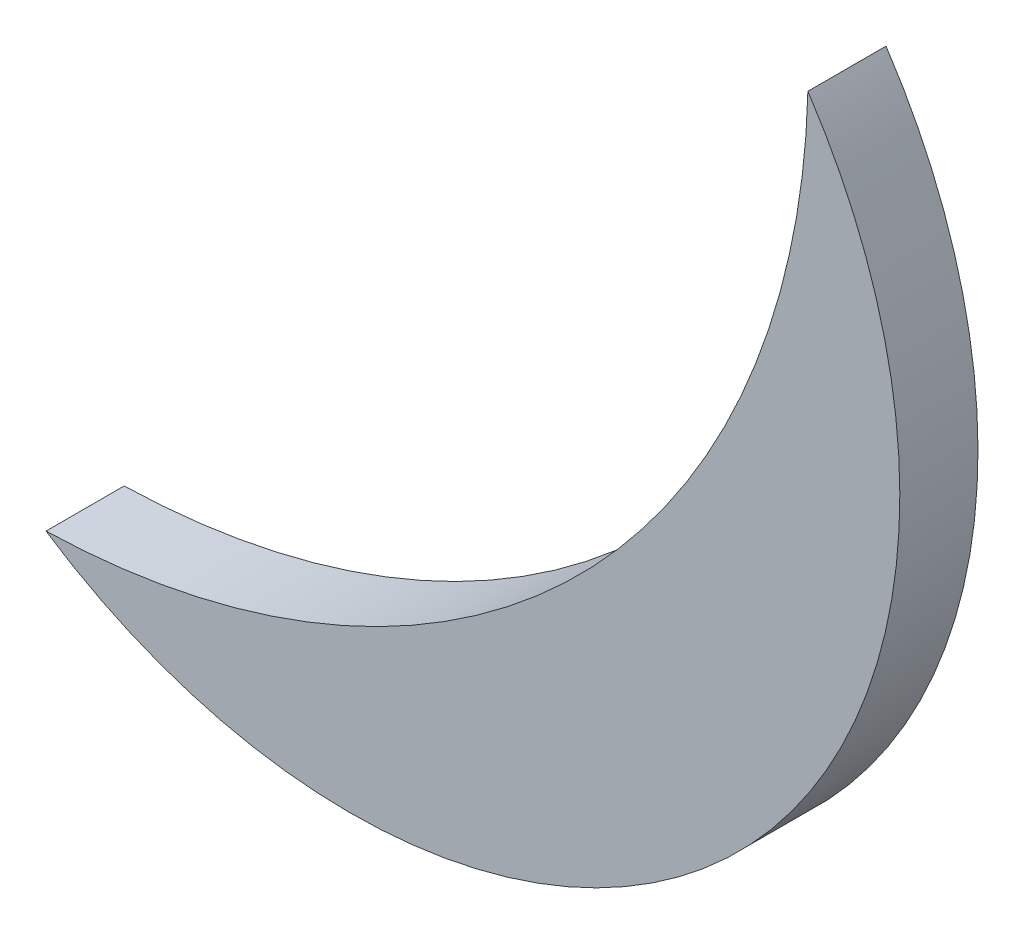
ISO-10303-21;
HEADER;
FILE_DESCRIPTION(('STEP AP214'),'2;1');
FILE_NAME('part.step','',(''),(''),'','','');
FILE_SCHEMA(('AUTOMOTIVE_DESIGN { 1 0 10303 214 1 1 1 1 }'));
ENDSEC;
DATA;
#1=APPLICATION_CONTEXT('core data for automotive mechanical design processes');
#2=APPLICATION_PROTOCOL_DEFINITION('international standard','automotive_design',2000,#1);
#3=PRODUCT_CONTEXT('',#1,'mechanical');
#4=PRODUCT('Part','Part','',(#3));
#5=PRODUCT_RELATED_PRODUCT_CATEGORY('part','',(#4));
#6=PRODUCT_DEFINITION_FORMATION('','',#4);
#7=PRODUCT_DEFINITION_CONTEXT('part definition',#1,'design');
#8=PRODUCT_DEFINITION('design','',#6,#7);
#9=PRODUCT_DEFINITION_SHAPE('','',#8);
#10=(LENGTH_UNIT() NAMED_UNIT(*) SI_UNIT(.MILLI.,.METRE.));
#11=(NAMED_UNIT(*) PLANE_ANGLE_UNIT() SI_UNIT($,.RADIAN.));
#12=(NAMED_UNIT(*) SI_UNIT($,.STERADIAN.) SOLID_ANGLE_UNIT());
#13=UNCERTAINTY_MEASURE_WITH_UNIT(LENGTH_MEASURE(1.E-05),#10,'distance_accuracy_value','');
#14=(GEOMETRIC_REPRESENTATION_CONTEXT(3) GLOBAL_UNCERTAINTY_ASSIGNED_CONTEXT((#13)) GLOBAL_UNIT_ASSIGNED_CONTEXT((#10,
#11,#12)) REPRESENTATION_CONTEXT('',''));
#15=CARTESIAN_POINT('',(0.,0.,0.));
#16=DIRECTION('',(0.,0.,1.));
#17=DIRECTION('',(1.,0.,0.));
#18=AXIS2_PLACEMENT_3D('',#15,#16,#17);
#19=CARTESIAN_POINT('',(107.04733226,84.85266748,0.));
#20=DIRECTION('',(0.,0.,-1.));
#21=DIRECTION('',(-0.707106781186519,-0.707106781186576,0.));
#22=AXIS2_PLACEMENT_3D('',#19,#20,#21);
#23=CYLINDRICAL_SURFACE('',#22,0.249999554103223);
#24=CARTESIAN_POINT('',(107.04733226,84.85266748,0.03556));
#25=DIRECTION('',(0.,0.,1.));
#26=DIRECTION('',(-0.707106781186519,-0.707106781186576,0.));
#27=AXIS2_PLACEMENT_3D('',#24,#25,#26);
#28=CIRCLE('',#27,0.249999554103223);
#29=CARTESIAN_POINT('',(106.90887421066,84.6445109388468,0.03556));
#30=VERTEX_POINT('',#29);
#31=CARTESIAN_POINT('',(107.255488801153,84.9911255293397,0.03556));
#32=VERTEX_POINT('',#31);
#33=EDGE_CURVE('E11',#30,#32,#28,.T.);
#34=ORIENTED_EDGE('',*,*,#33,.F.);
#35=DIRECTION('',(0.,0.,1.));
#36=VECTOR('',#35,1.);
#37=CARTESIAN_POINT('',(106.90887421066,84.6445109388468,0.));
#38=LINE('',#37,#36);
#39=CARTESIAN_POINT('',(106.90887421066,84.6445109388468,0.));
#40=VERTEX_POINT('',#39);
#41=EDGE_CURVE('E24',#40,#30,#38,.T.);
#42=ORIENTED_EDGE('',*,*,#41,.F.);
#43=CARTESIAN_POINT('',(107.04733226,84.85266748,0.));
#44=DIRECTION('',(0.,0.,1.));
#45=DIRECTION('',(-0.707106781186519,-0.707106781186576,0.));
#46=AXIS2_PLACEMENT_3D('',#43,#44,#45);
#47=CIRCLE('',#46,0.249999554103223);
#48=CARTESIAN_POINT('',(107.255488801153,84.9911255293397,0.));
#49=VERTEX_POINT('',#48);
#50=EDGE_CURVE('E46',#40,#49,#47,.T.);
#51=ORIENTED_EDGE('',*,*,#50,.T.);
#52=DIRECTION('',(0.,0.,1.));
#53=VECTOR('',#52,1.);
#54=CARTESIAN_POINT('',(107.255488801153,84.9911255293397,0.));
#55=LINE('',#54,#53);
#56=EDGE_CURVE('E37',#49,#32,#55,.T.);
#57=ORIENTED_EDGE('',*,*,#56,.T.);
#58=EDGE_LOOP('',(#34,#42,#51,#57));
#59=FACE_BOUND('',#58,.T.);
#60=ADVANCED_FACE('F17',(#59),#23,.T.);
#61=CARTESIAN_POINT('',(106.89999956,85.00000018,0.));
#62=DIRECTION('',(0.,0.,-1.));
#63=DIRECTION('',(1.,0.,0.));
#64=AXIS2_PLACEMENT_3D('',#61,#62,#63);
#65=CYLINDRICAL_SURFACE('',#64,0.3556);
#66=ORIENTED_EDGE('',*,*,#41,.T.);
#67=CARTESIAN_POINT('',(106.89999956,85.00000018,0.03556));
#68=DIRECTION('',(0.,0.,1.));
#69=DIRECTION('',(1.,0.,0.));
#70=AXIS2_PLACEMENT_3D('',#67,#68,#69);
#71=CIRCLE('',#70,0.3556);
#72=EDGE_CURVE('E45',#30,#32,#71,.T.);
#73=ORIENTED_EDGE('',*,*,#72,.T.);
#74=ORIENTED_EDGE('',*,*,#56,.F.);
#75=CARTESIAN_POINT('',(106.89999956,85.00000018,0.));
#76=DIRECTION('',(0.,0.,1.));
#77=DIRECTION('',(1.,0.,0.));
#78=AXIS2_PLACEMENT_3D('',#75,#76,#77);
#79=CIRCLE('',#78,0.3556);
#80=EDGE_CURVE('E43',#40,#49,#79,.T.);
#81=ORIENTED_EDGE('',*,*,#80,.F.);
#82=EDGE_LOOP('',(#66,#73,#74,#81));
#83=FACE_BOUND('',#82,.T.);
#84=ADVANCED_FACE('F41',(#83),#65,.F.);
#85=CARTESIAN_POINT('',(106.72322318,84.8232238,0.));
#86=DIRECTION('',(0.,0.,-1.));
#87=DIRECTION('',(-1.,0.,0.));
#88=AXIS2_PLACEMENT_3D('',#85,#86,#87);
#89=PLANE('',#88);
#90=ORIENTED_EDGE('',*,*,#50,.F.);
#91=ORIENTED_EDGE('',*,*,#80,.T.);
#92=EDGE_LOOP('',(#90,#91));
#93=FACE_BOUND('',#92,.T.);
#94=ADVANCED_FACE('F51',(#93),#89,.T.);
#95=CARTESIAN_POINT('',(106.72322318,84.8232238,0.03556));
#96=DIRECTION('',(0.,0.,-1.));
#97=DIRECTION('',(-1.,0.,0.));
#98=AXIS2_PLACEMENT_3D('',#95,#96,#97);
#99=PLANE('',#98);
#100=ORIENTED_EDGE('',*,*,#72,.F.);
#101=ORIENTED_EDGE('',*,*,#33,.T.);
#102=EDGE_LOOP('',(#100,#101));
#103=FACE_BOUND('',#102,.T.);
#104=ADVANCED_FACE('F55',(#103),#99,.F.);
#105=CLOSED_SHELL('',(#60,#84,#94,#104));
#106=MANIFOLD_SOLID_BREP('B1',#105);
#107=ADVANCED_BREP_SHAPE_REPRESENTATION('',(#18,#106),#14);
#108=SHAPE_DEFINITION_REPRESENTATION(#9,#107);
ENDSEC;
END-ISO-10303-21;
